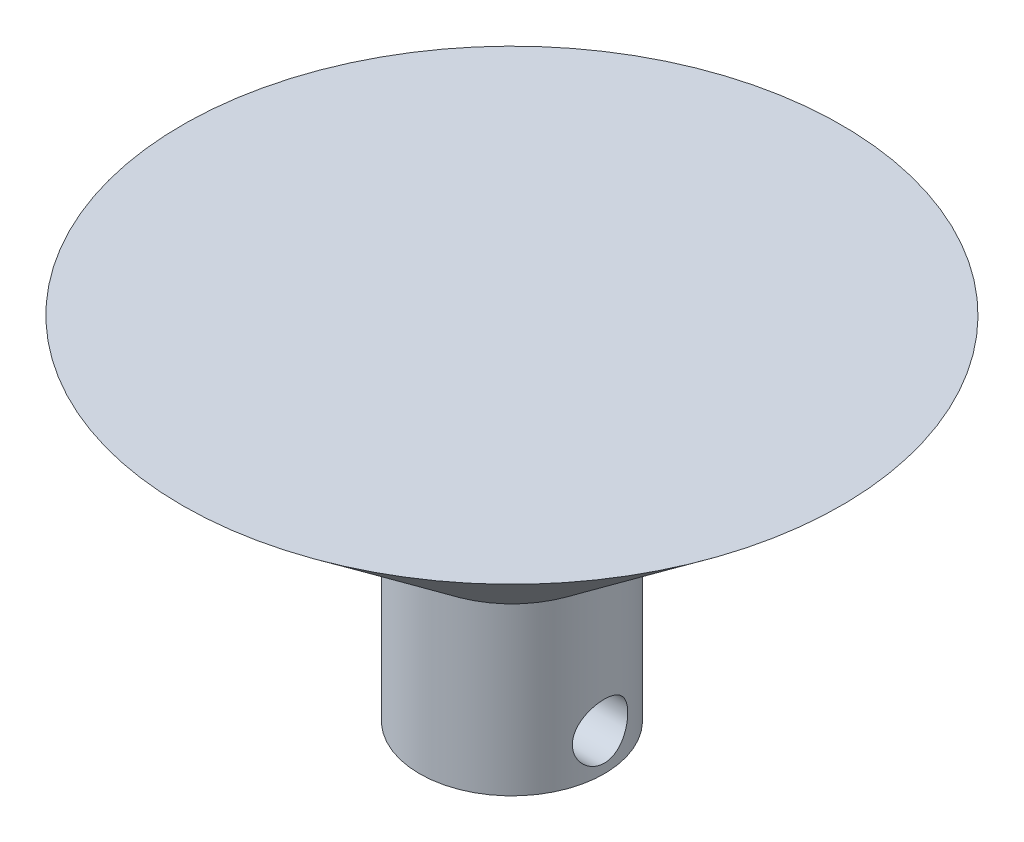
ISO-10303-21;
HEADER;
FILE_DESCRIPTION(('STEP AP214'),'2;1');
FILE_NAME('part.step','',(''),(''),'','','');
FILE_SCHEMA(('AUTOMOTIVE_DESIGN { 1 0 10303 214 1 1 1 1 }'));
ENDSEC;
DATA;
#1=APPLICATION_CONTEXT('core data for automotive mechanical design processes');
#2=APPLICATION_PROTOCOL_DEFINITION('international standard','automotive_design',2000,#1);
#3=PRODUCT_CONTEXT('',#1,'mechanical');
#4=PRODUCT('Part','Part','',(#3));
#5=PRODUCT_RELATED_PRODUCT_CATEGORY('part','',(#4));
#6=PRODUCT_DEFINITION_FORMATION('','',#4);
#7=PRODUCT_DEFINITION_CONTEXT('part definition',#1,'design');
#8=PRODUCT_DEFINITION('design','',#6,#7);
#9=PRODUCT_DEFINITION_SHAPE('','',#8);
#10=(LENGTH_UNIT() NAMED_UNIT(*) SI_UNIT(.MILLI.,.METRE.));
#11=(NAMED_UNIT(*) PLANE_ANGLE_UNIT() SI_UNIT($,.RADIAN.));
#12=(NAMED_UNIT(*) SI_UNIT($,.STERADIAN.) SOLID_ANGLE_UNIT());
#13=UNCERTAINTY_MEASURE_WITH_UNIT(LENGTH_MEASURE(1.E-05),#10,'distance_accuracy_value','');
#14=(GEOMETRIC_REPRESENTATION_CONTEXT(3) GLOBAL_UNCERTAINTY_ASSIGNED_CONTEXT((#13)) GLOBAL_UNIT_ASSIGNED_CONTEXT((#10,
#11,#12)) REPRESENTATION_CONTEXT('',''));
#15=CARTESIAN_POINT('',(0.,0.,0.));
#16=DIRECTION('',(0.,0.,1.));
#17=DIRECTION('',(1.,0.,0.));
#18=AXIS2_PLACEMENT_3D('',#15,#16,#17);
#19=CARTESIAN_POINT('',(0.,9.,0.));
#20=DIRECTION('',(0.,-1.,0.));
#21=DIRECTION('',(0.,0.,-1.));
#22=AXIS2_PLACEMENT_3D('',#19,#20,#21);
#23=CYLINDRICAL_SURFACE('',#22,5.);
#24=CARTESIAN_POINT('',(-5.,0.5,0.));
#25=CARTESIAN_POINT('',(-4.9999992925055,0.500000997484886,-0.0822886127533));
#26=CARTESIAN_POINT('',(-4.99794915693954,0.506793863623966,-0.164587318351529));
#27=CARTESIAN_POINT('',(-4.98997105593691,0.533721354222101,-0.326788125304881));
#28=CARTESIAN_POINT('',(-4.98404193389692,0.553859958023342,-0.40668950441142));
#29=CARTESIAN_POINT('',(-4.96895552501836,0.606746016910264,-0.561732707754527));
#30=CARTESIAN_POINT('',(-4.95980300250425,0.639474869618937,-0.636881364395373));
#31=CARTESIAN_POINT('',(-4.93922109237645,0.716536093055836,-0.780624181053131));
#32=CARTESIAN_POINT('',(-4.92779140192067,0.760870007395417,-0.84921746746967));
#33=CARTESIAN_POINT('',(-4.90350737192774,0.861224007472669,-0.979871797183745));
#34=CARTESIAN_POINT('',(-4.89062383657036,0.917516625885914,-1.04171807124434));
#35=CARTESIAN_POINT('',(-4.86505834210442,1.03960922991018,-1.15524920923324));
#36=CARTESIAN_POINT('',(-4.85237641724501,1.10541081212496,-1.20693236327441));
#37=CARTESIAN_POINT('',(-4.82834113993772,1.24647075303761,-1.29980037723708));
#38=CARTESIAN_POINT('',(-4.81702406663875,1.32190846099074,-1.34072309022213));
#39=CARTESIAN_POINT('',(-4.79743620394031,1.47898925423029,-1.4092139477476));
#40=CARTESIAN_POINT('',(-4.78916468313311,1.56063084392798,-1.43678529919973));
#41=CARTESIAN_POINT('',(-4.77690870838434,1.72539026613046,-1.47701633682652));
#42=CARTESIAN_POINT('',(-4.77281069324533,1.80840274386394,-1.49007196234677));
#43=CARTESIAN_POINT('',(-4.76902789749767,1.97553315621677,-1.50213730614672));
#44=CARTESIAN_POINT('',(-4.76934204760571,2.05965081805909,-1.50115042761078));
#45=CARTESIAN_POINT('',(-4.77424744067778,2.22338390860848,-1.48546977199812));
#46=CARTESIAN_POINT('',(-4.7786838859914,2.30305225036224,-1.47127205262685));
#47=CARTESIAN_POINT('',(-4.79108356228624,2.45881978627346,-1.43037420427056));
#48=CARTESIAN_POINT('',(-4.79904714132351,2.53491862737433,-1.40367284141641));
#49=CARTESIAN_POINT('',(-4.81772733074973,2.68260034966074,-1.33816026653682));
#50=CARTESIAN_POINT('',(-4.82848016115952,2.75410708395526,-1.29918816934642));
#51=CARTESIAN_POINT('',(-4.85150987000065,2.88973202201019,-1.21035222588683));
#52=CARTESIAN_POINT('',(-4.86378711746991,2.95384842941378,-1.16048574002588));
#53=CARTESIAN_POINT('',(-4.88911011297937,3.07568619076202,-1.04881290765546));
#54=CARTESIAN_POINT('',(-4.90216654310498,3.13302866402967,-0.986594907466972));
#55=CARTESIAN_POINT('',(-4.92712244063259,3.23655398406425,-0.853263259313967));
#56=CARTESIAN_POINT('',(-4.9390218351841,3.28273612841443,-0.782149051860888));
#57=CARTESIAN_POINT('',(-4.9604316006947,3.36285992246473,-0.632355038342803));
#58=CARTESIAN_POINT('',(-4.96992543668314,3.39671751624986,-0.55362774974795));
#59=CARTESIAN_POINT('',(-4.98533521832222,3.45059959009963,-0.39124541560352));
#60=CARTESIAN_POINT('',(-4.99125216186999,3.47062792853249,-0.307591751589582));
#61=CARTESIAN_POINT('',(-4.99868364643538,3.49565217789939,-0.140952242668332));
#62=CARTESIAN_POINT('',(-5.0003485041779,3.50116158580161,-0.0580500976011871));
#63=CARTESIAN_POINT('',(-4.9995292324176,3.49843084428792,0.107499605823383));
#64=CARTESIAN_POINT('',(-4.99704565677756,3.49019253034856,0.19014719669078));
#65=CARTESIAN_POINT('',(-4.98830696987163,3.4606153888885,0.350903605309697));
#66=CARTESIAN_POINT('',(-4.98213829799417,3.43957661241913,0.429072772614169));
#67=CARTESIAN_POINT('',(-4.96674347841533,3.3853567672218,0.580754638954522));
#68=CARTESIAN_POINT('',(-4.95751696321085,3.35217423896214,0.654266777025583));
#69=CARTESIAN_POINT('',(-4.93669654351325,3.27374683451887,0.796437189461052));
#70=CARTESIAN_POINT('',(-4.92505280829675,3.22824065905203,0.864943826199669));
#71=CARTESIAN_POINT('',(-4.90073468764318,3.12677524594719,0.993523307980147));
#72=CARTESIAN_POINT('',(-4.8880600443108,3.07081338811233,1.05359403235593));
#73=CARTESIAN_POINT('',(-4.86253171869138,2.94761269163066,1.16585744551027));
#74=CARTESIAN_POINT('',(-4.84968825033268,2.88003812422826,1.21768481231503));
#75=CARTESIAN_POINT('',(-4.82576515238464,2.73687206098647,1.30928995072154));
#76=CARTESIAN_POINT('',(-4.81468547654651,2.66128077544179,1.34906803829472));
#77=CARTESIAN_POINT('',(-4.79567189615055,2.50446750874531,1.41517347127168));
#78=CARTESIAN_POINT('',(-4.78772337843827,2.42327381346341,1.4415634693705));
#79=CARTESIAN_POINT('',(-4.77591594362794,2.25731203106852,1.48021730815114));
#80=CARTESIAN_POINT('',(-4.772055625083,2.17254517921233,1.49248598978779));
#81=CARTESIAN_POINT('',(-4.76899972496087,2.00563848162377,1.50221984485059));
#82=CARTESIAN_POINT('',(-4.76961647442754,1.92353634898242,1.5002805530849));
#83=CARTESIAN_POINT('',(-4.77499401288294,1.7608858966272,1.48307505444813));
#84=CARTESIAN_POINT('',(-4.77975463592551,1.68033751482365,1.46780938124716));
#85=CARTESIAN_POINT('',(-4.79275763670385,1.52405460085715,1.42476888804136));
#86=CARTESIAN_POINT('',(-4.80095604545965,1.44827271263831,1.39715175507068));
#87=CARTESIAN_POINT('',(-4.81990278909136,1.30235756118228,1.33031507121129));
#88=CARTESIAN_POINT('',(-4.83065161194312,1.23222538235924,1.29109329962876));
#89=CARTESIAN_POINT('',(-4.85397676425833,1.09683688347289,1.20048763805072));
#90=CARTESIAN_POINT('',(-4.86660540163798,1.03185123873959,1.14871276092994));
#91=CARTESIAN_POINT('',(-4.89201320450026,0.911297501692137,1.03517434629782));
#92=CARTESIAN_POINT('',(-4.90479240823905,0.855731860532243,0.973408217134502));
#93=CARTESIAN_POINT('',(-4.92950936570649,0.75397658770497,0.839465762183249));
#94=CARTESIAN_POINT('',(-4.94141159765674,0.708108553144511,0.767037885790608));
#95=CARTESIAN_POINT('',(-4.96260680455813,0.629264830095975,0.615141373983529));
#96=CARTESIAN_POINT('',(-4.97190099931067,0.596283111725492,0.535676052998955));
#97=CARTESIAN_POINT('',(-4.98602174969301,0.547104724347251,0.380757712655282));
#98=CARTESIAN_POINT('',(-4.99122027381068,0.529488327116752,0.305786961954234));
#99=CARTESIAN_POINT('',(-4.99820944494492,0.505936474758423,0.15388019523078));
#100=CARTESIAN_POINT('',(-5.0000006615474,0.499999067295181,0.0769445098581397));
#101=CARTESIAN_POINT('',(-5.,0.5,0.));
#102=B_SPLINE_CURVE_WITH_KNOTS('',3,(#24,#25,#26,#27,#28,#29,#30,#31,#32,#33,#34,#35,#36,#37,
#38,#39,#40,#41,#42,#43,#44,#45,#46,#47,#48,#49,#50,#51,#52,#53,#54,#55,#56,#57,#58,#59,#60,#61,
#62,#63,#64,#65,#66,#67,#68,#69,#70,#71,#72,#73,#74,#75,#76,#77,#78,#79,#80,#81,#82,#83,#84,#85,
#86,#87,#88,#89,#90,#91,#92,#93,#94,#95,#96,#97,#98,#99,#100,#101),.UNSPECIFIED.,.T.,.F.,(4,2,2,
2,2,2,2,2,2,2,2,2,2,2,2,2,2,2,2,2,2,2,2,2,2,2,2,2,2,2,2,2,2,2,2,2,2,2,4),(0.,0.246583203612611,
0.493239964846,0.739533676300874,0.985860164412702,1.23855602948191,1.49129437288633,
1.74971481004109,2.00807314543224,2.25919689356599,2.51025978319089,2.75226016697676,
2.99428443658001,3.23962426447119,3.48502360158555,3.74067104048166,3.99633456531071,
4.25371046881688,4.51101453528808,4.75908809438545,5.00712853550327,5.24956746682327,
5.49203554593728,5.74011305702908,5.98825282000191,6.24540400322818,6.5025484425268,
6.75847814951252,7.01432009460283,7.25950155466943,7.504673196616,7.74680040402721,
7.98897397553107,8.23996925679931,8.49102974897502,8.74942996156671,9.00770911595235,
9.23831691930459,9.46888616948874),.UNSPECIFIED.);
#103=CARTESIAN_POINT('',(-5.,0.5,0.));
#104=VERTEX_POINT('',#103);
#105=EDGE_CURVE('E11',#104,#104,#102,.T.);
#106=ORIENTED_EDGE('',*,*,#105,.T.);
#107=EDGE_LOOP('',(#106));
#108=FACE_BOUND('',#107,.T.);
#109=CARTESIAN_POINT('',(4.76969600708473,2.,-1.5));
#110=CARTESIAN_POINT('',(4.7696968572698,1.9178054520576,-1.49999897633764));
#111=CARTESIAN_POINT('',(4.77184390209069,1.83560077585598,-1.49322108167142));
#112=CARTESIAN_POINT('',(4.780165783029,1.67359475040806,-1.46635844446749));
#113=CARTESIAN_POINT('',(4.78634196493468,1.59379421349853,-1.44626925573578));
#114=CARTESIAN_POINT('',(4.80196102485632,1.43896527172827,-1.39352753269955));
#115=CARTESIAN_POINT('',(4.81139846703232,1.36392917036691,-1.36089589394243));
#116=CARTESIAN_POINT('',(4.83246932547567,1.2203780660047,-1.28406421917929));
#117=CARTESIAN_POINT('',(4.84410307041019,1.15186404131556,-1.23986245137053));
#118=CARTESIAN_POINT('',(4.86866862185765,1.02113360942262,-1.13964754141627));
#119=CARTESIAN_POINT('',(4.88162808311636,0.959154102053713,-1.08333207175807));
#120=CARTESIAN_POINT('',(4.90714861936757,0.845362048677491,-0.961136237579599));
#121=CARTESIAN_POINT('',(4.91970964297705,0.793550809550121,-0.895254645461111));
#122=CARTESIAN_POINT('',(4.94333214579389,0.700537300166693,-0.75411143779369));
#123=CARTESIAN_POINT('',(4.95435724342404,0.659576575557191,-0.678684021335815));
#124=CARTESIAN_POINT('',(4.97334435920684,0.591012740957243,-0.521624645369354));
#125=CARTESIAN_POINT('',(4.98130703789495,0.563406750142551,-0.439994028387912));
#126=CARTESIAN_POINT('',(4.99307646003589,0.523119998909491,-0.27532385263083));
#127=CARTESIAN_POINT('',(4.99699557369338,0.510034872347297,-0.192391398953801));
#128=CARTESIAN_POINT('',(5.00063201501348,0.497882675353559,-0.025421823749315));
#129=CARTESIAN_POINT('',(5.00035022521079,0.498812660598037,0.0586150620503682));
#130=CARTESIAN_POINT('',(4.99569603817659,0.514392868543023,0.22257115660016));
#131=CARTESIAN_POINT('',(4.9914542020526,0.528605193809869,0.302536267641341));
#132=CARTESIAN_POINT('',(4.97951522112593,0.56963133599429,0.458889213442527));
#133=CARTESIAN_POINT('',(4.97181785750586,0.596445950942671,0.535276821322846));
#134=CARTESIAN_POINT('',(4.95365220986963,0.662212023418558,0.683347326351281));
#135=CARTESIAN_POINT('',(4.94315269676706,0.701301202807267,0.754965064694478));
#136=CARTESIAN_POINT('',(4.92049640648069,0.790397852428228,0.890764673783156));
#137=CARTESIAN_POINT('',(4.90833923637778,0.840407912963484,0.954944774872131));
#138=CARTESIAN_POINT('',(4.88311550488165,0.952197750751597,1.0766604815298));
#139=CARTESIAN_POINT('',(4.87003195321461,1.01435691902974,1.13384458040111));
#140=CARTESIAN_POINT('',(4.84483979887497,1.14751001789005,1.23707651539824));
#141=CARTESIAN_POINT('',(4.8327312931702,1.21850482538923,1.28312324482853));
#142=CARTESIAN_POINT('',(4.81077903197678,1.36823946924899,1.3631399533545));
#143=CARTESIAN_POINT('',(4.80095810695957,1.44704704586292,1.39698989237679));
#144=CARTESIAN_POINT('',(4.78496392548436,1.60960720844554,1.45083362878413));
#145=CARTESIAN_POINT('',(4.7787894791583,1.69335817153456,1.4708319464056));
#146=CARTESIAN_POINT('',(4.77104849541241,1.86008236073928,1.49574770282165));
#147=CARTESIAN_POINT('',(4.7693187867044,1.94296822389398,1.50119946380212));
#148=CARTESIAN_POINT('',(4.77021192441924,2.10847290000987,1.49835947233062));
#149=CARTESIAN_POINT('',(4.77283416156589,2.19109174873085,1.4900696437133));
#150=CARTESIAN_POINT('',(4.78197558554912,2.35148837797087,1.4604576357419));
#151=CARTESIAN_POINT('',(4.78839176507489,2.42933616426352,1.4394796143128));
#152=CARTESIAN_POINT('',(4.80429141231227,2.58040169081492,1.3854857774794));
#153=CARTESIAN_POINT('',(4.81377535359073,2.65361871414057,1.3524681034276));
#154=CARTESIAN_POINT('',(4.83505835023047,2.79551746407213,1.274318711965));
#155=CARTESIAN_POINT('',(4.84691271069799,2.86402472098579,1.22888564172729));
#156=CARTESIAN_POINT('',(4.87148205646987,2.9926381061808,1.12755301600385));
#157=CARTESIAN_POINT('',(4.88419724730003,3.05274221761279,1.07165095534897));
#158=CARTESIAN_POINT('',(4.90963633548158,3.16518040581474,0.948455132493599));
#159=CARTESIAN_POINT('',(4.92234245063004,3.21713562898698,0.880811065857434));
#160=CARTESIAN_POINT('',(4.94584851748651,3.30896670102775,0.737461784590249));
#161=CARTESIAN_POINT('',(4.95664856384717,3.34884314978146,0.661756970543944));
#162=CARTESIAN_POINT('',(4.97505970474957,3.4150000305683,0.504935504705222));
#163=CARTESIAN_POINT('',(4.98269453424966,3.44138201615898,0.423864622037839));
#164=CARTESIAN_POINT('',(4.99401979596827,3.48006091889042,0.258169966504588));
#165=CARTESIAN_POINT('',(4.9977113567088,3.49236186594842,0.173547217354763));
#166=CARTESIAN_POINT('',(5.00066544081399,3.5022230440545,0.00665215388274265));
#167=CARTESIAN_POINT('',(5.00009305111322,3.50033269540783,-0.0755851790862068));
#168=CARTESIAN_POINT('',(4.99497264465037,3.48317836750088,-0.238519481164404));
#169=CARTESIAN_POINT('',(4.99042485330462,3.46791514651956,-0.319216537346529));
#170=CARTESIAN_POINT('',(4.97791168358327,3.42478833860038,-0.475935813041358));
#171=CARTESIAN_POINT('',(4.96998352900866,3.39706181935099,-0.551998927351392));
#172=CARTESIAN_POINT('',(4.9515294303945,3.32991808549281,-0.698433237752053));
#173=CARTESIAN_POINT('',(4.94100305949946,3.29049894971381,-0.76880349605058));
#174=CARTESIAN_POINT('',(4.91803965828228,3.19962654256996,-0.904301892420563));
#175=CARTESIAN_POINT('',(4.90555226923559,3.14782856999923,-0.969190250076767));
#176=CARTESIAN_POINT('',(4.88023537212334,3.0342896116672,-1.08953757134594));
#177=CARTESIAN_POINT('',(4.86740576641079,2.97254576210185,-1.14499380960194));
#178=CARTESIAN_POINT('',(4.84240680631319,2.83865922168949,-1.24656269394549));
#179=CARTESIAN_POINT('',(4.83026852693485,2.76626144660956,-1.29234759757956));
#180=CARTESIAN_POINT('',(4.80852547508793,2.61444482583898,-1.37104313528776));
#181=CARTESIAN_POINT('',(4.79891948596956,2.53502937639881,-1.40395995557289));
#182=CARTESIAN_POINT('',(4.78427816717594,2.38025956839373,-1.4530194253295));
#183=CARTESIAN_POINT('',(4.7788615484052,2.30539135306901,-1.47058859011232));
#184=CARTESIAN_POINT('',(4.77157042597167,2.15368477750423,-1.49407818835144));
#185=CARTESIAN_POINT('',(4.7696952122143,2.07684681535475,-1.50000095706095));
#186=CARTESIAN_POINT('',(4.76969600708473,2.,-1.5));
#187=B_SPLINE_CURVE_WITH_KNOTS('',3,(#109,#110,#111,#112,#113,#114,#115,#116,#117,#118,#119,
#120,#121,#122,#123,#124,#125,#126,#127,#128,#129,#130,#131,#132,#133,#134,#135,#136,#137,#138,
#139,#140,#141,#142,#143,#144,#145,#146,#147,#148,#149,#150,#151,#152,#153,#154,#155,#156,#157,
#158,#159,#160,#161,#162,#163,#164,#165,#166,#167,#168,#169,#170,#171,#172,#173,#174,#175,#176,
#177,#178,#179,#180,#181,#182,#183,#184,#185,#186),.UNSPECIFIED.,.T.,.F.,(4,2,2,2,2,2,2,2,2,2,2,
2,2,2,2,2,2,2,2,2,2,2,2,2,2,2,2,2,2,2,2,2,2,2,2,2,2,2,4),(0.,0.246300165915542,0.492682641689,
0.738656414466193,0.984667025370101,1.23773150007984,1.49082847871273,1.74915939273645,
2.00743455587877,2.25832140149558,2.5091555410144,2.7520012599088,2.99486235890376,
3.24055209335676,3.4863001659083,3.74152147023278,3.99676812491863,4.25446238246266,
4.51207250628411,4.76008080790309,5.00805439107388,5.24958594938817,5.49115481045787,
5.73920731809388,5.98731925928923,6.24479506100602,6.50225807324202,6.75775391814325,
7.01317662321682,7.2587630391122,7.50433553047755,7.74727096872219,7.99024634491378,
8.24099627054488,8.4918185262989,8.75011639669147,9.00828993963944,9.23861153857447,
9.4688869503356),.UNSPECIFIED.);
#188=CARTESIAN_POINT('',(4.76969600708473,2.,-1.5));
#189=VERTEX_POINT('',#188);
#190=EDGE_CURVE('E41',#189,#189,#187,.T.);
#191=ORIENTED_EDGE('',*,*,#190,.T.);
#192=EDGE_LOOP('',(#191));
#193=FACE_BOUND('',#192,.T.);
#194=CARTESIAN_POINT('',(0.,9.,0.));
#195=DIRECTION('',(0.,1.,0.));
#196=DIRECTION('',(0.,0.,1.));
#197=AXIS2_PLACEMENT_3D('',#194,#195,#196);
#198=CIRCLE('',#197,5.);
#199=CARTESIAN_POINT('',(0.,9.,5.));
#200=VERTEX_POINT('',#199);
#201=EDGE_CURVE('E46',#200,#200,#198,.T.);
#202=ORIENTED_EDGE('',*,*,#201,.F.);
#203=EDGE_LOOP('',(#202));
#204=FACE_BOUND('',#203,.T.);
#205=CARTESIAN_POINT('',(0.,0.,0.));
#206=DIRECTION('',(0.,1.,0.));
#207=DIRECTION('',(0.,0.,1.));
#208=AXIS2_PLACEMENT_3D('',#205,#206,#207);
#209=CIRCLE('',#208,5.);
#210=CARTESIAN_POINT('',(0.,0.,5.));
#211=VERTEX_POINT('',#210);
#212=EDGE_CURVE('E72',#211,#211,#209,.T.);
#213=ORIENTED_EDGE('',*,*,#212,.T.);
#214=EDGE_LOOP('',(#213));
#215=FACE_BOUND('',#214,.T.);
#216=ADVANCED_FACE('F33',(#108,#193,#204,#215),#23,.T.);
#217=CARTESIAN_POINT('',(0.,0.,0.));
#218=DIRECTION('',(0.,1.,0.));
#219=DIRECTION('',(0.,0.,1.));
#220=AXIS2_PLACEMENT_3D('',#217,#218,#219);
#221=PLANE('',#220);
#222=ORIENTED_EDGE('',*,*,#212,.F.);
#223=EDGE_LOOP('',(#222));
#224=FACE_BOUND('',#223,.T.);
#225=ADVANCED_FACE('F59',(#224),#221,.F.);
#226=CARTESIAN_POINT('',(-5.,2.,0.));
#227=DIRECTION('',(1.,0.,0.));
#228=DIRECTION('',(0.,0.,-1.));
#229=AXIS2_PLACEMENT_3D('',#226,#227,#228);
#230=CYLINDRICAL_SURFACE('',#229,1.5);
#231=ORIENTED_EDGE('',*,*,#190,.F.);
#232=EDGE_LOOP('',(#231));
#233=FACE_BOUND('',#232,.T.);
#234=ORIENTED_EDGE('',*,*,#105,.F.);
#235=EDGE_LOOP('',(#234));
#236=FACE_BOUND('',#235,.T.);
#237=ADVANCED_FACE('F54',(#233,#236),#230,.F.);
#238=CARTESIAN_POINT('',(0.,19.,0.));
#239=DIRECTION('',(0.,1.,0.));
#240=DIRECTION('',(0.,0.,1.));
#241=AXIS2_PLACEMENT_3D('',#238,#239,#240);
#242=PLANE('',#241);
#243=CARTESIAN_POINT('',(0.,19.,0.));
#244=DIRECTION('',(0.,1.,0.));
#245=DIRECTION('',(0.,0.,1.));
#246=AXIS2_PLACEMENT_3D('',#243,#244,#245);
#247=CIRCLE('',#246,17.841);
#248=CARTESIAN_POINT('',(0.,19.,17.841));
#249=VERTEX_POINT('',#248);
#250=EDGE_CURVE('E74',#249,#249,#247,.T.);
#251=ORIENTED_EDGE('',*,*,#250,.T.);
#252=EDGE_LOOP('',(#251));
#253=FACE_BOUND('',#252,.T.);
#254=ADVANCED_FACE('F58',(#253),#242,.T.);
#255=CARTESIAN_POINT('',(0.,9.,0.));
#256=DIRECTION('',(0.,1.,0.));
#257=DIRECTION('',(0.,0.,1.));
#258=AXIS2_PLACEMENT_3D('',#255,#256,#257);
#259=CONICAL_SURFACE('',#258,5.,0.909144220104199);
#260=CARTESIAN_POINT('',(0.,19.,17.841));
#261=CARTESIAN_POINT('',(0.,18.8958333333333,17.7072395833333));
#262=CARTESIAN_POINT('',(0.,18.7916666666667,17.5734791666667));
#263=CARTESIAN_POINT('',(0.,18.5833333333333,17.3059583333333));
#264=CARTESIAN_POINT('',(0.,18.4791666666667,17.1721979166667));
#265=CARTESIAN_POINT('',(0.,18.2708333333333,16.9046770833333));
#266=CARTESIAN_POINT('',(0.,18.1666666666667,16.7709166666667));
#267=CARTESIAN_POINT('',(0.,17.9583333333333,16.5033958333333));
#268=CARTESIAN_POINT('',(0.,17.8541666666667,16.3696354166667));
#269=CARTESIAN_POINT('',(0.,17.6458333333333,16.1021145833333));
#270=CARTESIAN_POINT('',(0.,17.5416666666667,15.9683541666667));
#271=CARTESIAN_POINT('',(0.,17.3333333333333,15.7008333333333));
#272=CARTESIAN_POINT('',(0.,17.2291666666667,15.5670729166667));
#273=CARTESIAN_POINT('',(0.,17.0208333333333,15.2995520833333));
#274=CARTESIAN_POINT('',(0.,16.9166666666667,15.1657916666667));
#275=CARTESIAN_POINT('',(0.,16.7083333333333,14.8982708333333));
#276=CARTESIAN_POINT('',(0.,16.6041666666667,14.7645104166667));
#277=CARTESIAN_POINT('',(0.,16.3958333333333,14.4969895833333));
#278=CARTESIAN_POINT('',(0.,16.2916666666667,14.3632291666667));
#279=CARTESIAN_POINT('',(0.,16.0833333333333,14.0957083333333));
#280=CARTESIAN_POINT('',(0.,15.9791666666667,13.9619479166667));
#281=CARTESIAN_POINT('',(0.,15.7708333333333,13.6944270833333));
#282=CARTESIAN_POINT('',(0.,15.6666666666667,13.5606666666667));
#283=CARTESIAN_POINT('',(0.,15.4583333333333,13.2931458333333));
#284=CARTESIAN_POINT('',(0.,15.3541666666667,13.1593854166667));
#285=CARTESIAN_POINT('',(0.,15.1458333333333,12.8918645833333));
#286=CARTESIAN_POINT('',(0.,15.0416666666667,12.7581041666667));
#287=CARTESIAN_POINT('',(0.,14.8333333333333,12.4905833333333));
#288=CARTESIAN_POINT('',(0.,14.7291666666667,12.3568229166667));
#289=CARTESIAN_POINT('',(0.,14.5208333333333,12.0893020833333));
#290=CARTESIAN_POINT('',(0.,14.4166666666667,11.9555416666667));
#291=CARTESIAN_POINT('',(0.,14.2083333333333,11.6880208333333));
#292=CARTESIAN_POINT('',(0.,14.1041666666667,11.5542604166667));
#293=CARTESIAN_POINT('',(0.,13.8958333333333,11.2867395833333));
#294=CARTESIAN_POINT('',(0.,13.7916666666667,11.1529791666667));
#295=CARTESIAN_POINT('',(0.,13.5833333333333,10.8854583333333));
#296=CARTESIAN_POINT('',(0.,13.4791666666667,10.7516979166667));
#297=CARTESIAN_POINT('',(0.,13.2708333333333,10.4841770833333));
#298=CARTESIAN_POINT('',(0.,13.1666666666667,10.3504166666667));
#299=CARTESIAN_POINT('',(0.,12.9583333333333,10.0828958333333));
#300=CARTESIAN_POINT('',(0.,12.8541666666667,9.94913541666667));
#301=CARTESIAN_POINT('',(0.,12.6458333333333,9.68161458333334));
#302=CARTESIAN_POINT('',(0.,12.5416666666667,9.54785416666667));
#303=CARTESIAN_POINT('',(0.,12.3333333333333,9.28033333333333));
#304=CARTESIAN_POINT('',(0.,12.2291666666667,9.14657291666667));
#305=CARTESIAN_POINT('',(0.,12.0208333333333,8.87905208333333));
#306=CARTESIAN_POINT('',(0.,11.9166666666667,8.74529166666667));
#307=CARTESIAN_POINT('',(0.,11.7083333333333,8.47777083333334));
#308=CARTESIAN_POINT('',(0.,11.6041666666667,8.34401041666667));
#309=CARTESIAN_POINT('',(0.,11.3958333333333,8.07648958333333));
#310=CARTESIAN_POINT('',(0.,11.2916666666667,7.94272916666667));
#311=CARTESIAN_POINT('',(0.,11.0833333333333,7.67520833333333));
#312=CARTESIAN_POINT('',(0.,10.9791666666667,7.54144791666667));
#313=CARTESIAN_POINT('',(0.,10.7708333333333,7.27392708333333));
#314=CARTESIAN_POINT('',(0.,10.6666666666667,7.14016666666667));
#315=CARTESIAN_POINT('',(0.,10.4583333333333,6.87264583333333));
#316=CARTESIAN_POINT('',(0.,10.3541666666667,6.73888541666667));
#317=CARTESIAN_POINT('',(0.,10.1458333333333,6.47136458333333));
#318=CARTESIAN_POINT('',(0.,10.0416666666667,6.33760416666667));
#319=CARTESIAN_POINT('',(0.,9.83333333333333,6.07008333333333));
#320=CARTESIAN_POINT('',(0.,9.72916666666667,5.93632291666667));
#321=CARTESIAN_POINT('',(0.,9.52083333333333,5.66880208333333));
#322=CARTESIAN_POINT('',(0.,9.41666666666667,5.53504166666667));
#323=CARTESIAN_POINT('',(0.,9.20833333333333,5.26752083333333));
#324=CARTESIAN_POINT('',(0.,9.10416666666667,5.13376041666667));
#325=CARTESIAN_POINT('',(0.,9.,5.));
#326=B_SPLINE_CURVE_WITH_KNOTS('',3,(#260,#261,#262,#263,#264,#265,#266,#267,#268,#269,#270,
#271,#272,#273,#274,#275,#276,#277,#278,#279,#280,#281,#282,#283,#284,#285,#286,#287,#288,#289,
#290,#291,#292,#293,#294,#295,#296,#297,#298,#299,#300,#301,#302,#303,#304,#305,#306,#307,#308,
#309,#310,#311,#312,#313,#314,#315,#316,#317,#318,#319,#320,#321,#322,#323,#324,#325),
.UNSPECIFIED.,.F.,.F.,(4,2,2,2,2,2,2,2,2,2,2,2,2,2,2,2,2,2,2,2,2,2,2,2,2,2,2,2,2,2,2,2,4),(0.,
0.508608780499868,1.01721756099974,1.5258263414996,2.03443512199947,2.54304390249934,
3.05165268299921,3.56026146349907,4.06887024399894,4.57747902449881,5.08608780499867,
5.59469658549854,6.10330536599841,6.61191414649828,7.12052292699815,7.62913170749801,
8.13774048799788,8.64634926849775,9.15495804899762,9.66356682949748,10.1721756099973,
10.6807843904972,11.1893931709971,11.698001951497,12.2066107319968,12.7152195124967,
13.2238282929966,13.7324370734964,14.2410458539963,14.7496546344962,15.258263414996,
15.7668721954959,16.2754809759958),.UNSPECIFIED.);
#327=EDGE_CURVE('BSEAM61',#249,#200,#326,.T.);
#328=ORIENTED_EDGE('',*,*,#250,.F.);
#329=ORIENTED_EDGE('',*,*,#201,.T.);
#330=ORIENTED_EDGE('',*,*,#327,.T.);
#331=ORIENTED_EDGE('',*,*,#327,.F.);
#332=EDGE_LOOP('',(#328,#330,#329,#331));
#333=FACE_BOUND('',#332,.T.);
#334=ADVANCED_FACE('F61',(#333),#259,.T.);
#335=CLOSED_SHELL('',(#216,#225,#237,#254,#334));
#336=MANIFOLD_SOLID_BREP('B2',#335);
#337=ADVANCED_BREP_SHAPE_REPRESENTATION('',(#18,#336),#14);
#338=SHAPE_DEFINITION_REPRESENTATION(#9,#337);
ENDSEC;
END-ISO-10303-21;
